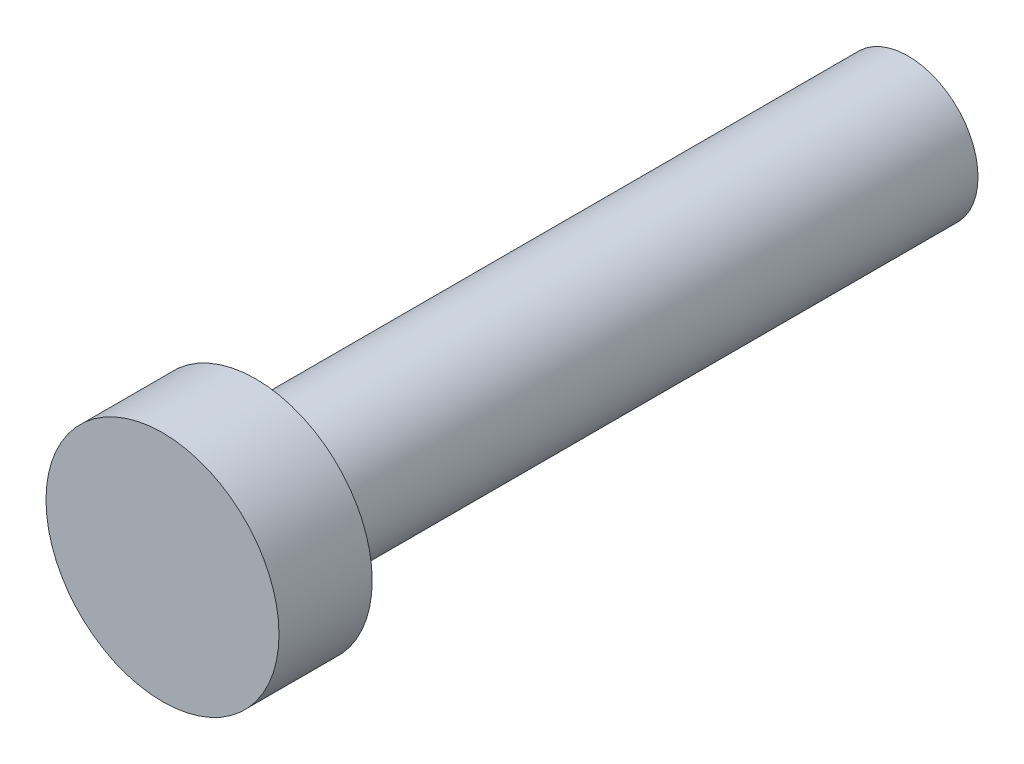
ISO-10303-21;
HEADER;
FILE_DESCRIPTION(('STEP AP214'),'2;1');
FILE_NAME('part.step','',(''),(''),'','','');
FILE_SCHEMA(('AUTOMOTIVE_DESIGN { 1 0 10303 214 1 1 1 1 }'));
ENDSEC;
DATA;
#1=APPLICATION_CONTEXT('core data for automotive mechanical design processes');
#2=APPLICATION_PROTOCOL_DEFINITION('international standard','automotive_design',2000,#1);
#3=PRODUCT_CONTEXT('',#1,'mechanical');
#4=PRODUCT('Part','Part','',(#3));
#5=PRODUCT_RELATED_PRODUCT_CATEGORY('part','',(#4));
#6=PRODUCT_DEFINITION_FORMATION('','',#4);
#7=PRODUCT_DEFINITION_CONTEXT('part definition',#1,'design');
#8=PRODUCT_DEFINITION('design','',#6,#7);
#9=PRODUCT_DEFINITION_SHAPE('','',#8);
#10=(LENGTH_UNIT() NAMED_UNIT(*) SI_UNIT(.MILLI.,.METRE.));
#11=(NAMED_UNIT(*) PLANE_ANGLE_UNIT() SI_UNIT($,.RADIAN.));
#12=(NAMED_UNIT(*) SI_UNIT($,.STERADIAN.) SOLID_ANGLE_UNIT());
#13=UNCERTAINTY_MEASURE_WITH_UNIT(LENGTH_MEASURE(1.E-05),#10,'distance_accuracy_value','');
#14=(GEOMETRIC_REPRESENTATION_CONTEXT(3) GLOBAL_UNCERTAINTY_ASSIGNED_CONTEXT((#13)) GLOBAL_UNIT_ASSIGNED_CONTEXT((#10,
#11,#12)) REPRESENTATION_CONTEXT('',''));
#15=CARTESIAN_POINT('',(0.,0.,0.));
#16=DIRECTION('',(0.,0.,1.));
#17=DIRECTION('',(1.,0.,0.));
#18=AXIS2_PLACEMENT_3D('',#15,#16,#17);
#19=CARTESIAN_POINT('',(0.,0.,-14.));
#20=DIRECTION('',(0.,0.,1.));
#21=DIRECTION('',(1.,0.,0.));
#22=AXIS2_PLACEMENT_3D('',#19,#20,#21);
#23=CYLINDRICAL_SURFACE('',#22,1.5);
#24=CARTESIAN_POINT('',(0.,0.,-14.));
#25=DIRECTION('',(0.,0.,1.));
#26=DIRECTION('',(1.,0.,0.));
#27=AXIS2_PLACEMENT_3D('',#24,#25,#26);
#28=CIRCLE('',#27,1.5);
#29=CARTESIAN_POINT('',(1.5,0.,-14.));
#30=VERTEX_POINT('',#29);
#31=EDGE_CURVE('E10',#30,#30,#28,.T.);
#32=ORIENTED_EDGE('',*,*,#31,.T.);
#33=EDGE_LOOP('',(#32));
#34=FACE_BOUND('',#33,.T.);
#35=CARTESIAN_POINT('',(0.,0.,0.));
#36=DIRECTION('',(0.,0.,1.));
#37=DIRECTION('',(1.,0.,0.));
#38=AXIS2_PLACEMENT_3D('',#35,#36,#37);
#39=CIRCLE('',#38,1.5);
#40=CARTESIAN_POINT('',(1.5,0.,0.));
#41=VERTEX_POINT('',#40);
#42=EDGE_CURVE('E44',#41,#41,#39,.T.);
#43=ORIENTED_EDGE('',*,*,#42,.F.);
#44=EDGE_LOOP('',(#43));
#45=FACE_BOUND('',#44,.T.);
#46=ADVANCED_FACE('F41',(#34,#45),#23,.T.);
#47=CARTESIAN_POINT('',(0.,0.,-14.));
#48=DIRECTION('',(0.,0.,1.));
#49=DIRECTION('',(1.,0.,0.));
#50=AXIS2_PLACEMENT_3D('',#47,#48,#49);
#51=PLANE('',#50);
#52=ORIENTED_EDGE('',*,*,#31,.F.);
#53=EDGE_LOOP('',(#52));
#54=FACE_BOUND('',#53,.T.);
#55=ADVANCED_FACE('F68',(#54),#51,.F.);
#56=CARTESIAN_POINT('',(0.,0.,2.));
#57=DIRECTION('',(0.,0.,-1.));
#58=DIRECTION('',(-1.,0.,0.));
#59=AXIS2_PLACEMENT_3D('',#56,#57,#58);
#60=CYLINDRICAL_SURFACE('',#59,2.5);
#61=CARTESIAN_POINT('',(0.,0.,2.));
#62=DIRECTION('',(0.,0.,1.));
#63=DIRECTION('',(1.,0.,0.));
#64=AXIS2_PLACEMENT_3D('',#61,#62,#63);
#65=CIRCLE('',#64,2.5);
#66=CARTESIAN_POINT('',(2.5,0.,2.));
#67=VERTEX_POINT('',#66);
#68=EDGE_CURVE('E53',#67,#67,#65,.T.);
#69=ORIENTED_EDGE('',*,*,#68,.F.);
#70=EDGE_LOOP('',(#69));
#71=FACE_BOUND('',#70,.T.);
#72=CARTESIAN_POINT('',(0.,0.,0.));
#73=DIRECTION('',(0.,0.,1.));
#74=DIRECTION('',(1.,0.,0.));
#75=AXIS2_PLACEMENT_3D('',#72,#73,#74);
#76=CIRCLE('',#75,2.5);
#77=CARTESIAN_POINT('',(2.5,0.,0.));
#78=VERTEX_POINT('',#77);
#79=EDGE_CURVE('E55',#78,#78,#76,.T.);
#80=ORIENTED_EDGE('',*,*,#79,.T.);
#81=EDGE_LOOP('',(#80));
#82=FACE_BOUND('',#81,.T.);
#83=ADVANCED_FACE('F65',(#71,#82),#60,.T.);
#84=CARTESIAN_POINT('',(0.,0.,2.));
#85=DIRECTION('',(0.,0.,1.));
#86=DIRECTION('',(1.,0.,0.));
#87=AXIS2_PLACEMENT_3D('',#84,#85,#86);
#88=PLANE('',#87);
#89=ORIENTED_EDGE('',*,*,#68,.T.);
#90=EDGE_LOOP('',(#89));
#91=FACE_BOUND('',#90,.T.);
#92=ADVANCED_FACE('F63',(#91),#88,.T.);
#93=CARTESIAN_POINT('',(0.,0.,0.));
#94=DIRECTION('',(0.,0.,1.));
#95=DIRECTION('',(1.,0.,0.));
#96=AXIS2_PLACEMENT_3D('',#93,#94,#95);
#97=PLANE('',#96);
#98=ORIENTED_EDGE('',*,*,#42,.T.);
#99=EDGE_LOOP('',(#98));
#100=FACE_BOUND('',#99,.T.);
#101=ORIENTED_EDGE('',*,*,#79,.F.);
#102=EDGE_LOOP('',(#101));
#103=FACE_BOUND('',#102,.T.);
#104=ADVANCED_FACE('F72',(#100,#103),#97,.F.);
#105=CLOSED_SHELL('',(#46,#55,#83,#92,#104));
#106=MANIFOLD_SOLID_BREP('B2',#105);
#107=ADVANCED_BREP_SHAPE_REPRESENTATION('',(#18,#106),#14);
#108=SHAPE_DEFINITION_REPRESENTATION(#9,#107);
ENDSEC;
END-ISO-10303-21;
